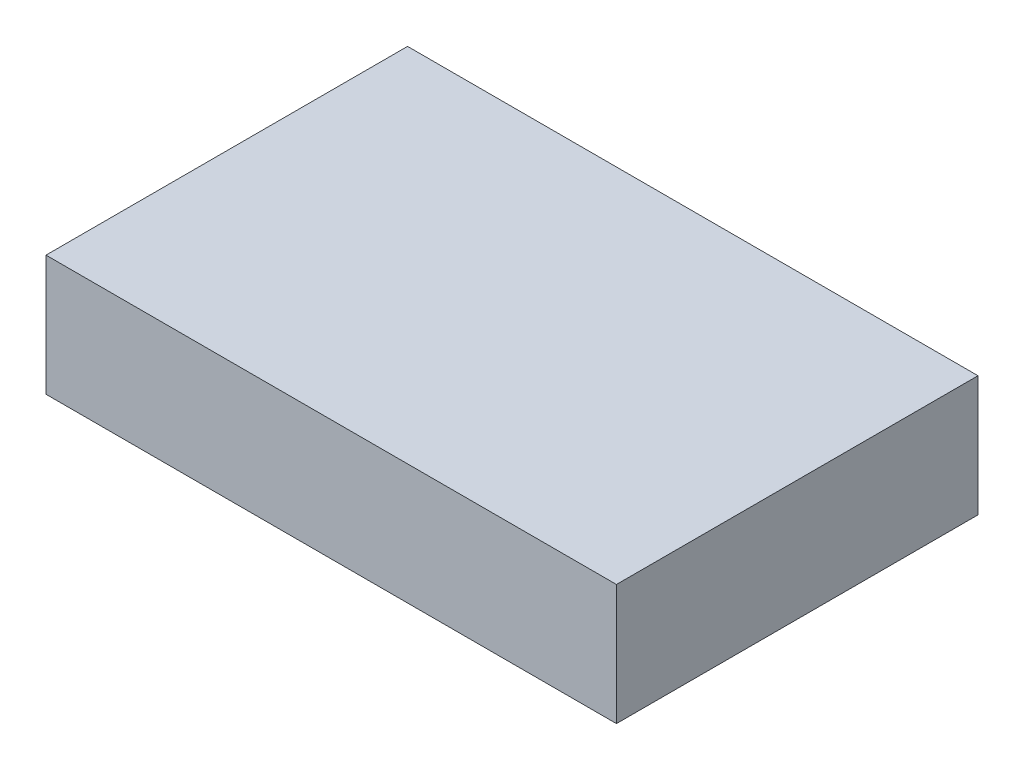
ISO-10303-21;
HEADER;
FILE_DESCRIPTION(('STEP AP214'),'2;1');
FILE_NAME('part.step','',(''),(''),'','','');
FILE_SCHEMA(('AUTOMOTIVE_DESIGN { 1 0 10303 214 1 1 1 1 }'));
ENDSEC;
DATA;
#1=APPLICATION_CONTEXT('core data for automotive mechanical design processes');
#2=APPLICATION_PROTOCOL_DEFINITION('international standard','automotive_design',2000,#1);
#3=PRODUCT_CONTEXT('',#1,'mechanical');
#4=PRODUCT('Part','Part','',(#3));
#5=PRODUCT_RELATED_PRODUCT_CATEGORY('part','',(#4));
#6=PRODUCT_DEFINITION_FORMATION('','',#4);
#7=PRODUCT_DEFINITION_CONTEXT('part definition',#1,'design');
#8=PRODUCT_DEFINITION('design','',#6,#7);
#9=PRODUCT_DEFINITION_SHAPE('','',#8);
#10=(LENGTH_UNIT() NAMED_UNIT(*) SI_UNIT(.MILLI.,.METRE.));
#11=(NAMED_UNIT(*) PLANE_ANGLE_UNIT() SI_UNIT($,.RADIAN.));
#12=(NAMED_UNIT(*) SI_UNIT($,.STERADIAN.) SOLID_ANGLE_UNIT());
#13=UNCERTAINTY_MEASURE_WITH_UNIT(LENGTH_MEASURE(1.E-05),#10,'distance_accuracy_value','');
#14=(GEOMETRIC_REPRESENTATION_CONTEXT(3) GLOBAL_UNCERTAINTY_ASSIGNED_CONTEXT((#13)) GLOBAL_UNIT_ASSIGNED_CONTEXT((#10,
#11,#12)) REPRESENTATION_CONTEXT('',''));
#15=CARTESIAN_POINT('',(0.,0.,0.));
#16=DIRECTION('',(0.,0.,1.));
#17=DIRECTION('',(1.,0.,0.));
#18=AXIS2_PLACEMENT_3D('',#15,#16,#17);
#19=CARTESIAN_POINT('',(0.,15.,0.));
#20=DIRECTION('',(1.,0.,0.));
#21=DIRECTION('',(0.,0.,-1.));
#22=AXIS2_PLACEMENT_3D('',#19,#20,#21);
#23=PLANE('',#22);
#24=DIRECTION('',(0.,0.,1.));
#25=VECTOR('',#24,1.);
#26=CARTESIAN_POINT('',(0.,0.,0.));
#27=LINE('',#26,#25);
#28=CARTESIAN_POINT('',(0.,0.,-45.));
#29=VERTEX_POINT('',#28);
#30=CARTESIAN_POINT('',(0.,0.,0.));
#31=VERTEX_POINT('',#30);
#32=EDGE_CURVE('E108',#29,#31,#27,.T.);
#33=ORIENTED_EDGE('',*,*,#32,.T.);
#34=DIRECTION('',(0.,-1.,0.));
#35=VECTOR('',#34,1.);
#36=CARTESIAN_POINT('',(0.,15.,0.));
#37=LINE('',#36,#35);
#38=CARTESIAN_POINT('',(0.,15.,0.));
#39=VERTEX_POINT('',#38);
#40=EDGE_CURVE('E11',#39,#31,#37,.T.);
#41=ORIENTED_EDGE('',*,*,#40,.F.);
#42=DIRECTION('',(0.,0.,1.));
#43=VECTOR('',#42,1.);
#44=CARTESIAN_POINT('',(0.,15.,0.));
#45=LINE('',#44,#43);
#46=CARTESIAN_POINT('',(0.,15.,-45.));
#47=VERTEX_POINT('',#46);
#48=EDGE_CURVE('E96',#47,#39,#45,.T.);
#49=ORIENTED_EDGE('',*,*,#48,.F.);
#50=DIRECTION('',(0.,-1.,0.));
#51=VECTOR('',#50,1.);
#52=CARTESIAN_POINT('',(0.,15.,-45.));
#53=LINE('',#52,#51);
#54=EDGE_CURVE('E104',#47,#29,#53,.T.);
#55=ORIENTED_EDGE('',*,*,#54,.T.);
#56=EDGE_LOOP('',(#33,#41,#49,#55));
#57=FACE_BOUND('',#56,.T.);
#58=ADVANCED_FACE('F45',(#57),#23,.F.);
#59=CARTESIAN_POINT('',(0.,15.,0.));
#60=DIRECTION('',(0.,0.,-1.));
#61=DIRECTION('',(-1.,0.,0.));
#62=AXIS2_PLACEMENT_3D('',#59,#60,#61);
#63=PLANE('',#62);
#64=DIRECTION('',(1.,0.,0.));
#65=VECTOR('',#64,1.);
#66=CARTESIAN_POINT('',(0.,0.,0.));
#67=LINE('',#66,#65);
#68=CARTESIAN_POINT('',(71.,0.,0.));
#69=VERTEX_POINT('',#68);
#70=EDGE_CURVE('E100',#31,#69,#67,.T.);
#71=ORIENTED_EDGE('',*,*,#70,.T.);
#72=DIRECTION('',(0.,-1.,0.));
#73=VECTOR('',#72,1.);
#74=CARTESIAN_POINT('',(71.,15.,0.));
#75=LINE('',#74,#73);
#76=CARTESIAN_POINT('',(71.,15.,0.));
#77=VERTEX_POINT('',#76);
#78=EDGE_CURVE('E53',#77,#69,#75,.T.);
#79=ORIENTED_EDGE('',*,*,#78,.F.);
#80=DIRECTION('',(1.,0.,0.));
#81=VECTOR('',#80,1.);
#82=CARTESIAN_POINT('',(0.,15.,0.));
#83=LINE('',#82,#81);
#84=EDGE_CURVE('E91',#39,#77,#83,.T.);
#85=ORIENTED_EDGE('',*,*,#84,.F.);
#86=ORIENTED_EDGE('',*,*,#40,.T.);
#87=EDGE_LOOP('',(#71,#79,#85,#86));
#88=FACE_BOUND('',#87,.T.);
#89=ADVANCED_FACE('F99',(#88),#63,.F.);
#90=CARTESIAN_POINT('',(71.,15.,0.));
#91=DIRECTION('',(-1.,0.,0.));
#92=DIRECTION('',(0.,0.,1.));
#93=AXIS2_PLACEMENT_3D('',#90,#91,#92);
#94=PLANE('',#93);
#95=DIRECTION('',(0.,0.,-1.));
#96=VECTOR('',#95,1.);
#97=CARTESIAN_POINT('',(71.,0.,0.));
#98=LINE('',#97,#96);
#99=CARTESIAN_POINT('',(71.,0.,-45.));
#100=VERTEX_POINT('',#99);
#101=EDGE_CURVE('E78',#69,#100,#98,.T.);
#102=ORIENTED_EDGE('',*,*,#101,.T.);
#103=DIRECTION('',(0.,-1.,0.));
#104=VECTOR('',#103,1.);
#105=CARTESIAN_POINT('',(71.,15.,-45.));
#106=LINE('',#105,#104);
#107=CARTESIAN_POINT('',(71.,15.,-45.));
#108=VERTEX_POINT('',#107);
#109=EDGE_CURVE('E101',#108,#100,#106,.T.);
#110=ORIENTED_EDGE('',*,*,#109,.F.);
#111=DIRECTION('',(0.,0.,-1.));
#112=VECTOR('',#111,1.);
#113=CARTESIAN_POINT('',(71.,15.,0.));
#114=LINE('',#113,#112);
#115=EDGE_CURVE('E94',#77,#108,#114,.T.);
#116=ORIENTED_EDGE('',*,*,#115,.F.);
#117=ORIENTED_EDGE('',*,*,#78,.T.);
#118=EDGE_LOOP('',(#102,#110,#116,#117));
#119=FACE_BOUND('',#118,.T.);
#120=ADVANCED_FACE('F102',(#119),#94,.F.);
#121=CARTESIAN_POINT('',(0.,15.,-45.));
#122=DIRECTION('',(0.,0.,1.));
#123=DIRECTION('',(1.,0.,0.));
#124=AXIS2_PLACEMENT_3D('',#121,#122,#123);
#125=PLANE('',#124);
#126=DIRECTION('',(-1.,0.,0.));
#127=VECTOR('',#126,1.);
#128=CARTESIAN_POINT('',(0.,0.,-45.));
#129=LINE('',#128,#127);
#130=EDGE_CURVE('E84',#100,#29,#129,.T.);
#131=ORIENTED_EDGE('',*,*,#130,.T.);
#132=ORIENTED_EDGE('',*,*,#54,.F.);
#133=DIRECTION('',(-1.,0.,0.));
#134=VECTOR('',#133,1.);
#135=CARTESIAN_POINT('',(0.,15.,-45.));
#136=LINE('',#135,#134);
#137=EDGE_CURVE('E61',#108,#47,#136,.T.);
#138=ORIENTED_EDGE('',*,*,#137,.F.);
#139=ORIENTED_EDGE('',*,*,#109,.T.);
#140=EDGE_LOOP('',(#131,#132,#138,#139));
#141=FACE_BOUND('',#140,.T.);
#142=ADVANCED_FACE('F115',(#141),#125,.F.);
#143=CARTESIAN_POINT('',(0.,15.,0.));
#144=DIRECTION('',(0.,-1.,0.));
#145=DIRECTION('',(0.,0.,-1.));
#146=AXIS2_PLACEMENT_3D('',#143,#144,#145);
#147=PLANE('',#146);
#148=ORIENTED_EDGE('',*,*,#48,.T.);
#149=ORIENTED_EDGE('',*,*,#84,.T.);
#150=ORIENTED_EDGE('',*,*,#115,.T.);
#151=ORIENTED_EDGE('',*,*,#137,.T.);
#152=EDGE_LOOP('',(#148,#149,#150,#151));
#153=FACE_BOUND('',#152,.T.);
#154=ADVANCED_FACE('F92',(#153),#147,.F.);
#155=CARTESIAN_POINT('',(0.,0.,0.));
#156=DIRECTION('',(0.,-1.,0.));
#157=DIRECTION('',(0.,0.,-1.));
#158=AXIS2_PLACEMENT_3D('',#155,#156,#157);
#159=PLANE('',#158);
#160=ORIENTED_EDGE('',*,*,#32,.F.);
#161=ORIENTED_EDGE('',*,*,#130,.F.);
#162=ORIENTED_EDGE('',*,*,#101,.F.);
#163=ORIENTED_EDGE('',*,*,#70,.F.);
#164=EDGE_LOOP('',(#160,#161,#162,#163));
#165=FACE_BOUND('',#164,.T.);
#166=ADVANCED_FACE('F118',(#165),#159,.T.);
#167=CLOSED_SHELL('',(#58,#89,#120,#142,#154,#166));
#168=MANIFOLD_SOLID_BREP('B2',#167);
#169=ADVANCED_BREP_SHAPE_REPRESENTATION('',(#18,#168),#14);
#170=SHAPE_DEFINITION_REPRESENTATION(#9,#169);
ENDSEC;
END-ISO-10303-21;
